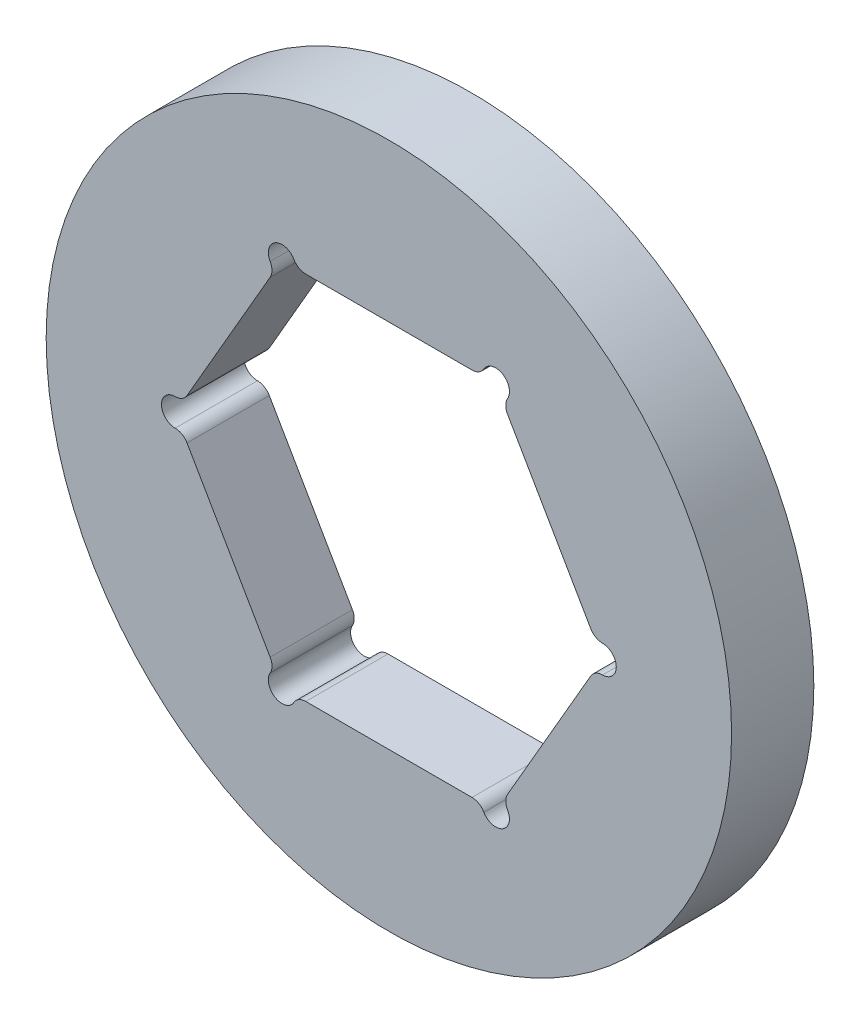
ISO-10303-21;
HEADER;
FILE_DESCRIPTION(('STEP AP214'),'2;1');
FILE_NAME('part.step','',(''),(''),'','','');
FILE_SCHEMA(('AUTOMOTIVE_DESIGN { 1 0 10303 214 1 1 1 1 }'));
ENDSEC;
DATA;
#1=APPLICATION_CONTEXT('core data for automotive mechanical design processes');
#2=APPLICATION_PROTOCOL_DEFINITION('international standard','automotive_design',2000,#1);
#3=PRODUCT_CONTEXT('',#1,'mechanical');
#4=PRODUCT('Part','Part','',(#3));
#5=PRODUCT_RELATED_PRODUCT_CATEGORY('part','',(#4));
#6=PRODUCT_DEFINITION_FORMATION('','',#4);
#7=PRODUCT_DEFINITION_CONTEXT('part definition',#1,'design');
#8=PRODUCT_DEFINITION('design','',#6,#7);
#9=PRODUCT_DEFINITION_SHAPE('','',#8);
#10=(LENGTH_UNIT() NAMED_UNIT(*) SI_UNIT(.MILLI.,.METRE.));
#11=(NAMED_UNIT(*) PLANE_ANGLE_UNIT() SI_UNIT($,.RADIAN.));
#12=(NAMED_UNIT(*) SI_UNIT($,.STERADIAN.) SOLID_ANGLE_UNIT());
#13=UNCERTAINTY_MEASURE_WITH_UNIT(LENGTH_MEASURE(1.E-05),#10,'distance_accuracy_value','');
#14=(GEOMETRIC_REPRESENTATION_CONTEXT(3) GLOBAL_UNCERTAINTY_ASSIGNED_CONTEXT((#13)) GLOBAL_UNIT_ASSIGNED_CONTEXT((#10,
#11,#12)) REPRESENTATION_CONTEXT('',''));
#15=CARTESIAN_POINT('',(0.,0.,0.));
#16=DIRECTION('',(0.,0.,1.));
#17=DIRECTION('',(1.,0.,0.));
#18=AXIS2_PLACEMENT_3D('',#15,#16,#17);
#19=CARTESIAN_POINT('',(0.,0.,3.));
#20=DIRECTION('',(0.,0.,1.));
#21=DIRECTION('',(1.,0.,0.));
#22=AXIS2_PLACEMENT_3D('',#19,#20,#21);
#23=PLANE('',#22);
#24=CARTESIAN_POINT('',(-15.5884572681199,0.,3.));
#25=DIRECTION('',(0.,0.,1.));
#26=DIRECTION('',(1.,0.,0.));
#27=AXIS2_PLACEMENT_3D('',#24,#25,#26);
#28=CIRCLE('',#27,1.);
#29=CARTESIAN_POINT('',(-15.5884572681199,1.00000000000001,3.));
#30=VERTEX_POINT('',#29);
#31=CARTESIAN_POINT('',(-15.5884572681199,-0.999999999999998,3.));
#32=VERTEX_POINT('',#31);
#33=EDGE_CURVE('E215',#30,#32,#28,.T.);
#34=ORIENTED_EDGE('',*,*,#33,.F.);
#35=CARTESIAN_POINT('',(-15.5884572681199,2.,3.));
#36=DIRECTION('',(0.,0.,1.));
#37=DIRECTION('',(1.,0.,0.));
#38=AXIS2_PLACEMENT_3D('',#35,#36,#37);
#39=CIRCLE('',#38,1.);
#40=CARTESIAN_POINT('',(-14.7224318643355,1.5,3.));
#41=VERTEX_POINT('',#40);
#42=EDGE_CURVE('E197',#30,#41,#39,.T.);
#43=ORIENTED_EDGE('',*,*,#42,.T.);
#44=DIRECTION('',(-0.5,-0.866025403784439,0.));
#45=VECTOR('',#44,1.);
#46=CARTESIAN_POINT('',(-7.79422863405995,13.5,3.));
#47=LINE('',#46,#45);
#48=CARTESIAN_POINT('',(-8.66025403784439,12.,3.));
#49=VERTEX_POINT('',#48);
#50=EDGE_CURVE('E255',#49,#41,#47,.T.);
#51=ORIENTED_EDGE('',*,*,#50,.F.);
#52=CARTESIAN_POINT('',(-9.52627944162883,12.5,3.));
#53=DIRECTION('',(0.,0.,1.));
#54=DIRECTION('',(1.,0.,0.));
#55=AXIS2_PLACEMENT_3D('',#52,#53,#54);
#56=CIRCLE('',#55,1.);
#57=CARTESIAN_POINT('',(-8.66025403784439,13.,3.));
#58=VERTEX_POINT('',#57);
#59=EDGE_CURVE('E296',#49,#58,#56,.T.);
#60=ORIENTED_EDGE('',*,*,#59,.T.);
#61=CARTESIAN_POINT('',(-7.79422863405995,13.5,3.));
#62=DIRECTION('',(0.,0.,1.));
#63=DIRECTION('',(1.,0.,0.));
#64=AXIS2_PLACEMENT_3D('',#61,#62,#63);
#65=CIRCLE('',#64,1.);
#66=CARTESIAN_POINT('',(-6.92820323027551,14.,3.));
#67=VERTEX_POINT('',#66);
#68=EDGE_CURVE('E251',#67,#58,#65,.T.);
#69=ORIENTED_EDGE('',*,*,#68,.F.);
#70=CARTESIAN_POINT('',(-6.06217782649107,14.5,3.));
#71=DIRECTION('',(0.,0.,1.));
#72=DIRECTION('',(1.,0.,0.));
#73=AXIS2_PLACEMENT_3D('',#70,#71,#72);
#74=CIRCLE('',#73,1.);
#75=CARTESIAN_POINT('',(-6.06217782649107,13.5,3.));
#76=VERTEX_POINT('',#75);
#77=EDGE_CURVE('E219',#67,#76,#74,.T.);
#78=ORIENTED_EDGE('',*,*,#77,.T.);
#79=DIRECTION('',(-1.,0.,0.));
#80=VECTOR('',#79,1.);
#81=CARTESIAN_POINT('',(7.79422863405996,13.5,3.));
#82=LINE('',#81,#80);
#83=CARTESIAN_POINT('',(6.06217782649108,13.5,3.));
#84=VERTEX_POINT('',#83);
#85=EDGE_CURVE('E270',#84,#76,#82,.T.);
#86=ORIENTED_EDGE('',*,*,#85,.F.);
#87=CARTESIAN_POINT('',(6.06217782649108,14.5,3.));
#88=DIRECTION('',(0.,0.,1.));
#89=DIRECTION('',(1.,0.,0.));
#90=AXIS2_PLACEMENT_3D('',#87,#88,#89);
#91=CIRCLE('',#90,1.);
#92=CARTESIAN_POINT('',(6.92820323027552,14.,3.));
#93=VERTEX_POINT('',#92);
#94=EDGE_CURVE('E300',#84,#93,#91,.T.);
#95=ORIENTED_EDGE('',*,*,#94,.T.);
#96=CARTESIAN_POINT('',(7.79422863405996,13.5,3.));
#97=DIRECTION('',(0.,0.,1.));
#98=DIRECTION('',(1.,0.,0.));
#99=AXIS2_PLACEMENT_3D('',#96,#97,#98);
#100=CIRCLE('',#99,0.999999999999999);
#101=CARTESIAN_POINT('',(8.66025403784439,13.,3.));
#102=VERTEX_POINT('',#101);
#103=EDGE_CURVE('E227',#102,#93,#100,.T.);
#104=ORIENTED_EDGE('',*,*,#103,.F.);
#105=CARTESIAN_POINT('',(9.52627944162883,12.5,3.));
#106=DIRECTION('',(0.,0.,1.));
#107=DIRECTION('',(1.,0.,0.));
#108=AXIS2_PLACEMENT_3D('',#105,#106,#107);
#109=CIRCLE('',#108,1.);
#110=CARTESIAN_POINT('',(8.66025403784439,12.,3.));
#111=VERTEX_POINT('',#110);
#112=EDGE_CURVE('E298',#102,#111,#109,.T.);
#113=ORIENTED_EDGE('',*,*,#112,.T.);
#114=DIRECTION('',(-0.5,0.866025403784439,0.));
#115=VECTOR('',#114,1.);
#116=CARTESIAN_POINT('',(15.5884572681199,0.,3.));
#117=LINE('',#116,#115);
#118=CARTESIAN_POINT('',(14.7224318643355,1.50000000000001,3.));
#119=VERTEX_POINT('',#118);
#120=EDGE_CURVE('E267',#119,#111,#117,.T.);
#121=ORIENTED_EDGE('',*,*,#120,.F.);
#122=CARTESIAN_POINT('',(15.5884572681199,2.00000000000001,3.));
#123=DIRECTION('',(0.,0.,1.));
#124=DIRECTION('',(1.,0.,0.));
#125=AXIS2_PLACEMENT_3D('',#122,#123,#124);
#126=CIRCLE('',#125,1.);
#127=CARTESIAN_POINT('',(15.5884572681199,1.00000000000001,3.));
#128=VERTEX_POINT('',#127);
#129=EDGE_CURVE('E304',#119,#128,#126,.T.);
#130=ORIENTED_EDGE('',*,*,#129,.T.);
#131=CARTESIAN_POINT('',(15.5884572681199,0.,3.));
#132=DIRECTION('',(0.,0.,1.));
#133=DIRECTION('',(1.,0.,0.));
#134=AXIS2_PLACEMENT_3D('',#131,#132,#133);
#135=CIRCLE('',#134,1.);
#136=CARTESIAN_POINT('',(15.5884572681199,-0.999999999999994,3.));
#137=VERTEX_POINT('',#136);
#138=EDGE_CURVE('E244',#137,#128,#135,.T.);
#139=ORIENTED_EDGE('',*,*,#138,.F.);
#140=CARTESIAN_POINT('',(15.5884572681199,-1.99999999999999,3.));
#141=DIRECTION('',(0.,0.,1.));
#142=DIRECTION('',(1.,0.,0.));
#143=AXIS2_PLACEMENT_3D('',#140,#141,#142);
#144=CIRCLE('',#143,1.);
#145=CARTESIAN_POINT('',(14.7224318643355,-1.49999999999999,3.));
#146=VERTEX_POINT('',#145);
#147=EDGE_CURVE('E302',#137,#146,#144,.T.);
#148=ORIENTED_EDGE('',*,*,#147,.T.);
#149=DIRECTION('',(0.5,0.866025403784439,0.));
#150=VECTOR('',#149,1.);
#151=CARTESIAN_POINT('',(7.79422863405995,-13.5,3.));
#152=LINE('',#151,#150);
#153=CARTESIAN_POINT('',(8.66025403784439,-12.,3.));
#154=VERTEX_POINT('',#153);
#155=EDGE_CURVE('E264',#154,#146,#152,.T.);
#156=ORIENTED_EDGE('',*,*,#155,.F.);
#157=CARTESIAN_POINT('',(9.52627944162883,-12.5,3.));
#158=DIRECTION('',(0.,0.,1.));
#159=DIRECTION('',(1.,0.,0.));
#160=AXIS2_PLACEMENT_3D('',#157,#158,#159);
#161=CIRCLE('',#160,1.);
#162=CARTESIAN_POINT('',(8.66025403784439,-13.,3.));
#163=VERTEX_POINT('',#162);
#164=EDGE_CURVE('E306',#154,#163,#161,.T.);
#165=ORIENTED_EDGE('',*,*,#164,.T.);
#166=CARTESIAN_POINT('',(7.79422863405995,-13.5,3.));
#167=DIRECTION('',(0.,0.,1.));
#168=DIRECTION('',(1.,0.,0.));
#169=AXIS2_PLACEMENT_3D('',#166,#167,#168);
#170=CIRCLE('',#169,1.);
#171=CARTESIAN_POINT('',(6.92820323027551,-14.,3.));
#172=VERTEX_POINT('',#171);
#173=EDGE_CURVE('E238',#172,#163,#170,.T.);
#174=ORIENTED_EDGE('',*,*,#173,.F.);
#175=CARTESIAN_POINT('',(6.06217782649107,-14.5,3.));
#176=DIRECTION('',(0.,0.,1.));
#177=DIRECTION('',(1.,0.,0.));
#178=AXIS2_PLACEMENT_3D('',#175,#176,#177);
#179=CIRCLE('',#178,1.);
#180=CARTESIAN_POINT('',(6.06217782649107,-13.5,3.));
#181=VERTEX_POINT('',#180);
#182=EDGE_CURVE('E308',#172,#181,#179,.T.);
#183=ORIENTED_EDGE('',*,*,#182,.T.);
#184=DIRECTION('',(1.,0.,0.));
#185=VECTOR('',#184,1.);
#186=CARTESIAN_POINT('',(-7.79422863405996,-13.5,3.));
#187=LINE('',#186,#185);
#188=CARTESIAN_POINT('',(-6.06217782649108,-13.5,3.));
#189=VERTEX_POINT('',#188);
#190=EDGE_CURVE('E261',#189,#181,#187,.T.);
#191=ORIENTED_EDGE('',*,*,#190,.F.);
#192=CARTESIAN_POINT('',(-6.06217782649108,-14.5,3.));
#193=DIRECTION('',(0.,0.,1.));
#194=DIRECTION('',(1.,0.,0.));
#195=AXIS2_PLACEMENT_3D('',#192,#193,#194);
#196=CIRCLE('',#195,1.);
#197=CARTESIAN_POINT('',(-6.92820323027552,-14.,3.));
#198=VERTEX_POINT('',#197);
#199=EDGE_CURVE('E310',#189,#198,#196,.T.);
#200=ORIENTED_EDGE('',*,*,#199,.T.);
#201=CARTESIAN_POINT('',(-7.79422863405996,-13.5,3.));
#202=DIRECTION('',(0.,0.,1.));
#203=DIRECTION('',(1.,0.,0.));
#204=AXIS2_PLACEMENT_3D('',#201,#202,#203);
#205=CIRCLE('',#204,1.);
#206=CARTESIAN_POINT('',(-8.66025403784439,-13.,3.));
#207=VERTEX_POINT('',#206);
#208=EDGE_CURVE('E230',#207,#198,#205,.T.);
#209=ORIENTED_EDGE('',*,*,#208,.F.);
#210=CARTESIAN_POINT('',(-9.52627944162883,-12.5,3.));
#211=DIRECTION('',(0.,0.,1.));
#212=DIRECTION('',(1.,0.,0.));
#213=AXIS2_PLACEMENT_3D('',#210,#211,#212);
#214=CIRCLE('',#213,1.);
#215=CARTESIAN_POINT('',(-8.66025403784439,-12.,3.));
#216=VERTEX_POINT('',#215);
#217=EDGE_CURVE('E312',#207,#216,#214,.T.);
#218=ORIENTED_EDGE('',*,*,#217,.T.);
#219=DIRECTION('',(0.5,-0.866025403784439,0.));
#220=VECTOR('',#219,1.);
#221=CARTESIAN_POINT('',(-15.5884572681199,0.,3.));
#222=LINE('',#221,#220);
#223=CARTESIAN_POINT('',(-14.7224318643355,-1.5,3.));
#224=VERTEX_POINT('',#223);
#225=EDGE_CURVE('E257',#224,#216,#222,.T.);
#226=ORIENTED_EDGE('',*,*,#225,.F.);
#227=CARTESIAN_POINT('',(-15.5884572681199,-2.,3.));
#228=DIRECTION('',(0.,0.,1.));
#229=DIRECTION('',(1.,0.,0.));
#230=AXIS2_PLACEMENT_3D('',#227,#228,#229);
#231=CIRCLE('',#230,1.);
#232=EDGE_CURVE('E208',#224,#32,#231,.T.);
#233=ORIENTED_EDGE('',*,*,#232,.T.);
#234=EDGE_LOOP('',(#34,#43,#51,#60,#69,#78,#86,#95,#104,#113,#121,#130,#139,#148,#156,#165,#174,
#183,#191,#200,#209,#218,#226,#233));
#235=FACE_BOUND('',#234,.T.);
#236=CARTESIAN_POINT('',(0.,0.,3.));
#237=DIRECTION('',(0.,0.,1.));
#238=DIRECTION('',(1.,0.,0.));
#239=AXIS2_PLACEMENT_3D('',#236,#237,#238);
#240=CIRCLE('',#239,25.);
#241=CARTESIAN_POINT('',(25.,0.,3.));
#242=VERTEX_POINT('',#241);
#243=EDGE_CURVE('E289',#242,#242,#240,.T.);
#244=ORIENTED_EDGE('',*,*,#243,.T.);
#245=EDGE_LOOP('',(#244));
#246=FACE_BOUND('',#245,.T.);
#247=ADVANCED_FACE('F33',(#235,#246),#23,.T.);
#248=CARTESIAN_POINT('',(0.,0.,-3.));
#249=DIRECTION('',(0.,0.,1.));
#250=DIRECTION('',(1.,0.,0.));
#251=AXIS2_PLACEMENT_3D('',#248,#249,#250);
#252=PLANE('',#251);
#253=CARTESIAN_POINT('',(0.,0.,-3.));
#254=DIRECTION('',(0.,0.,1.));
#255=DIRECTION('',(1.,0.,0.));
#256=AXIS2_PLACEMENT_3D('',#253,#254,#255);
#257=CIRCLE('',#256,25.);
#258=CARTESIAN_POINT('',(25.,0.,-3.));
#259=VERTEX_POINT('',#258);
#260=EDGE_CURVE('E273',#259,#259,#257,.T.);
#261=ORIENTED_EDGE('',*,*,#260,.F.);
#262=EDGE_LOOP('',(#261));
#263=FACE_BOUND('',#262,.T.);
#264=DIRECTION('',(-0.5,-0.866025403784439,0.));
#265=VECTOR('',#264,1.);
#266=CARTESIAN_POINT('',(-7.79422863405995,13.5,-3.));
#267=LINE('',#266,#265);
#268=CARTESIAN_POINT('',(-8.66025403784439,12.,-3.));
#269=VERTEX_POINT('',#268);
#270=CARTESIAN_POINT('',(-14.7224318643355,1.5,-3.));
#271=VERTEX_POINT('',#270);
#272=EDGE_CURVE('E250',#269,#271,#267,.T.);
#273=ORIENTED_EDGE('',*,*,#272,.T.);
#274=CARTESIAN_POINT('',(-15.5884572681199,2.,-3.));
#275=DIRECTION('',(0.,0.,1.));
#276=DIRECTION('',(1.,0.,0.));
#277=AXIS2_PLACEMENT_3D('',#274,#275,#276);
#278=CIRCLE('',#277,1.);
#279=CARTESIAN_POINT('',(-15.5884572681199,1.00000000000001,-3.));
#280=VERTEX_POINT('',#279);
#281=EDGE_CURVE('E337',#271,#280,#278,.F.);
#282=ORIENTED_EDGE('',*,*,#281,.T.);
#283=CARTESIAN_POINT('',(-15.5884572681199,0.,-3.));
#284=DIRECTION('',(0.,0.,1.));
#285=DIRECTION('',(1.,0.,0.));
#286=AXIS2_PLACEMENT_3D('',#283,#284,#285);
#287=CIRCLE('',#286,1.);
#288=CARTESIAN_POINT('',(-15.5884572681199,-0.999999999999998,-3.));
#289=VERTEX_POINT('',#288);
#290=EDGE_CURVE('E218',#280,#289,#287,.T.);
#291=ORIENTED_EDGE('',*,*,#290,.T.);
#292=CARTESIAN_POINT('',(-15.5884572681199,-2.,-3.));
#293=DIRECTION('',(0.,0.,1.));
#294=DIRECTION('',(1.,0.,0.));
#295=AXIS2_PLACEMENT_3D('',#292,#293,#294);
#296=CIRCLE('',#295,1.);
#297=CARTESIAN_POINT('',(-14.7224318643355,-1.5,-3.));
#298=VERTEX_POINT('',#297);
#299=EDGE_CURVE('E335',#289,#298,#296,.F.);
#300=ORIENTED_EDGE('',*,*,#299,.T.);
#301=DIRECTION('',(0.5,-0.866025403784439,0.));
#302=VECTOR('',#301,1.);
#303=CARTESIAN_POINT('',(-15.5884572681199,0.,-3.));
#304=LINE('',#303,#302);
#305=CARTESIAN_POINT('',(-8.66025403784439,-12.,-3.));
#306=VERTEX_POINT('',#305);
#307=EDGE_CURVE('E276',#298,#306,#304,.T.);
#308=ORIENTED_EDGE('',*,*,#307,.T.);
#309=CARTESIAN_POINT('',(-9.52627944162883,-12.5,-3.));
#310=DIRECTION('',(0.,0.,1.));
#311=DIRECTION('',(1.,0.,0.));
#312=AXIS2_PLACEMENT_3D('',#309,#310,#311);
#313=CIRCLE('',#312,1.);
#314=CARTESIAN_POINT('',(-8.66025403784439,-13.,-3.));
#315=VERTEX_POINT('',#314);
#316=EDGE_CURVE('E333',#306,#315,#313,.F.);
#317=ORIENTED_EDGE('',*,*,#316,.T.);
#318=CARTESIAN_POINT('',(-7.79422863405996,-13.5,-3.));
#319=DIRECTION('',(0.,0.,1.));
#320=DIRECTION('',(1.,0.,0.));
#321=AXIS2_PLACEMENT_3D('',#318,#319,#320);
#322=CIRCLE('',#321,1.);
#323=CARTESIAN_POINT('',(-6.92820323027552,-14.,-3.));
#324=VERTEX_POINT('',#323);
#325=EDGE_CURVE('E225',#315,#324,#322,.T.);
#326=ORIENTED_EDGE('',*,*,#325,.T.);
#327=CARTESIAN_POINT('',(-6.06217782649108,-14.5,-3.));
#328=DIRECTION('',(0.,0.,1.));
#329=DIRECTION('',(1.,0.,0.));
#330=AXIS2_PLACEMENT_3D('',#327,#328,#329);
#331=CIRCLE('',#330,1.);
#332=CARTESIAN_POINT('',(-6.06217782649108,-13.5,-3.));
#333=VERTEX_POINT('',#332);
#334=EDGE_CURVE('E331',#324,#333,#331,.F.);
#335=ORIENTED_EDGE('',*,*,#334,.T.);
#336=DIRECTION('',(1.,0.,0.));
#337=VECTOR('',#336,1.);
#338=CARTESIAN_POINT('',(-7.79422863405996,-13.5,-3.));
#339=LINE('',#338,#337);
#340=CARTESIAN_POINT('',(6.06217782649107,-13.5,-3.));
#341=VERTEX_POINT('',#340);
#342=EDGE_CURVE('E279',#333,#341,#339,.T.);
#343=ORIENTED_EDGE('',*,*,#342,.T.);
#344=CARTESIAN_POINT('',(6.06217782649107,-14.5,-3.));
#345=DIRECTION('',(0.,0.,1.));
#346=DIRECTION('',(1.,0.,0.));
#347=AXIS2_PLACEMENT_3D('',#344,#345,#346);
#348=CIRCLE('',#347,1.);
#349=CARTESIAN_POINT('',(6.92820323027551,-14.,-3.));
#350=VERTEX_POINT('',#349);
#351=EDGE_CURVE('E56',#341,#350,#348,.F.);
#352=ORIENTED_EDGE('',*,*,#351,.T.);
#353=CARTESIAN_POINT('',(7.79422863405995,-13.5,-3.));
#354=DIRECTION('',(0.,0.,1.));
#355=DIRECTION('',(1.,0.,0.));
#356=AXIS2_PLACEMENT_3D('',#353,#354,#355);
#357=CIRCLE('',#356,1.);
#358=CARTESIAN_POINT('',(8.66025403784439,-13.,-3.));
#359=VERTEX_POINT('',#358);
#360=EDGE_CURVE('E236',#350,#359,#357,.T.);
#361=ORIENTED_EDGE('',*,*,#360,.T.);
#362=CARTESIAN_POINT('',(9.52627944162883,-12.5,-3.));
#363=DIRECTION('',(0.,0.,1.));
#364=DIRECTION('',(1.,0.,0.));
#365=AXIS2_PLACEMENT_3D('',#362,#363,#364);
#366=CIRCLE('',#365,1.);
#367=CARTESIAN_POINT('',(8.66025403784439,-12.,-3.));
#368=VERTEX_POINT('',#367);
#369=EDGE_CURVE('E48',#359,#368,#366,.F.);
#370=ORIENTED_EDGE('',*,*,#369,.T.);
#371=DIRECTION('',(0.5,0.866025403784439,0.));
#372=VECTOR('',#371,1.);
#373=CARTESIAN_POINT('',(7.79422863405995,-13.5,-3.));
#374=LINE('',#373,#372);
#375=CARTESIAN_POINT('',(14.7224318643355,-1.49999999999999,-3.));
#376=VERTEX_POINT('',#375);
#377=EDGE_CURVE('E281',#368,#376,#374,.T.);
#378=ORIENTED_EDGE('',*,*,#377,.T.);
#379=CARTESIAN_POINT('',(15.5884572681199,-1.99999999999999,-3.));
#380=DIRECTION('',(0.,0.,1.));
#381=DIRECTION('',(1.,0.,0.));
#382=AXIS2_PLACEMENT_3D('',#379,#380,#381);
#383=CIRCLE('',#382,1.);
#384=CARTESIAN_POINT('',(15.5884572681199,-0.999999999999994,-3.));
#385=VERTEX_POINT('',#384);
#386=EDGE_CURVE('E325',#376,#385,#383,.F.);
#387=ORIENTED_EDGE('',*,*,#386,.T.);
#388=CARTESIAN_POINT('',(15.5884572681199,0.,-3.));
#389=DIRECTION('',(0.,0.,1.));
#390=DIRECTION('',(1.,0.,0.));
#391=AXIS2_PLACEMENT_3D('',#388,#389,#390);
#392=CIRCLE('',#391,1.);
#393=CARTESIAN_POINT('',(15.5884572681199,1.00000000000001,-3.));
#394=VERTEX_POINT('',#393);
#395=EDGE_CURVE('E241',#385,#394,#392,.T.);
#396=ORIENTED_EDGE('',*,*,#395,.T.);
#397=CARTESIAN_POINT('',(15.5884572681199,2.00000000000001,-3.));
#398=DIRECTION('',(0.,0.,1.));
#399=DIRECTION('',(1.,0.,0.));
#400=AXIS2_PLACEMENT_3D('',#397,#398,#399);
#401=CIRCLE('',#400,1.);
#402=CARTESIAN_POINT('',(14.7224318643355,1.50000000000001,-3.));
#403=VERTEX_POINT('',#402);
#404=EDGE_CURVE('E327',#394,#403,#401,.F.);
#405=ORIENTED_EDGE('',*,*,#404,.T.);
#406=DIRECTION('',(-0.5,0.866025403784439,0.));
#407=VECTOR('',#406,1.);
#408=CARTESIAN_POINT('',(15.5884572681199,0.,-3.));
#409=LINE('',#408,#407);
#410=CARTESIAN_POINT('',(8.66025403784439,12.,-3.));
#411=VERTEX_POINT('',#410);
#412=EDGE_CURVE('E284',#403,#411,#409,.T.);
#413=ORIENTED_EDGE('',*,*,#412,.T.);
#414=CARTESIAN_POINT('',(9.52627944162883,12.5,-3.));
#415=DIRECTION('',(0.,0.,1.));
#416=DIRECTION('',(1.,0.,0.));
#417=AXIS2_PLACEMENT_3D('',#414,#415,#416);
#418=CIRCLE('',#417,1.);
#419=CARTESIAN_POINT('',(8.66025403784439,13.,-3.));
#420=VERTEX_POINT('',#419);
#421=EDGE_CURVE('E321',#411,#420,#418,.F.);
#422=ORIENTED_EDGE('',*,*,#421,.T.);
#423=CARTESIAN_POINT('',(7.79422863405996,13.5,-3.));
#424=DIRECTION('',(0.,0.,1.));
#425=DIRECTION('',(1.,0.,0.));
#426=AXIS2_PLACEMENT_3D('',#423,#424,#425);
#427=CIRCLE('',#426,0.999999999999999);
#428=CARTESIAN_POINT('',(6.92820323027552,14.,-3.));
#429=VERTEX_POINT('',#428);
#430=EDGE_CURVE('E254',#420,#429,#427,.T.);
#431=ORIENTED_EDGE('',*,*,#430,.T.);
#432=CARTESIAN_POINT('',(6.06217782649108,14.5,-3.));
#433=DIRECTION('',(0.,0.,1.));
#434=DIRECTION('',(1.,0.,0.));
#435=AXIS2_PLACEMENT_3D('',#432,#433,#434);
#436=CIRCLE('',#435,1.);
#437=CARTESIAN_POINT('',(6.06217782649108,13.5,-3.));
#438=VERTEX_POINT('',#437);
#439=EDGE_CURVE('E323',#429,#438,#436,.F.);
#440=ORIENTED_EDGE('',*,*,#439,.T.);
#441=DIRECTION('',(-1.,0.,0.));
#442=VECTOR('',#441,1.);
#443=CARTESIAN_POINT('',(7.79422863405996,13.5,-3.));
#444=LINE('',#443,#442);
#445=CARTESIAN_POINT('',(-6.06217782649107,13.5,-3.));
#446=VERTEX_POINT('',#445);
#447=EDGE_CURVE('E258',#438,#446,#444,.T.);
#448=ORIENTED_EDGE('',*,*,#447,.T.);
#449=CARTESIAN_POINT('',(-6.06217782649107,14.5,-3.));
#450=DIRECTION('',(0.,0.,1.));
#451=DIRECTION('',(1.,0.,0.));
#452=AXIS2_PLACEMENT_3D('',#449,#450,#451);
#453=CIRCLE('',#452,1.);
#454=CARTESIAN_POINT('',(-6.92820323027551,14.,-3.));
#455=VERTEX_POINT('',#454);
#456=EDGE_CURVE('E317',#446,#455,#453,.F.);
#457=ORIENTED_EDGE('',*,*,#456,.T.);
#458=CARTESIAN_POINT('',(-7.79422863405995,13.5,-3.));
#459=DIRECTION('',(0.,0.,1.));
#460=DIRECTION('',(1.,0.,0.));
#461=AXIS2_PLACEMENT_3D('',#458,#459,#460);
#462=CIRCLE('',#461,1.);
#463=CARTESIAN_POINT('',(-8.66025403784439,13.,-3.));
#464=VERTEX_POINT('',#463);
#465=EDGE_CURVE('E247',#455,#464,#462,.T.);
#466=ORIENTED_EDGE('',*,*,#465,.T.);
#467=CARTESIAN_POINT('',(-9.52627944162883,12.5,-3.));
#468=DIRECTION('',(0.,0.,1.));
#469=DIRECTION('',(1.,0.,0.));
#470=AXIS2_PLACEMENT_3D('',#467,#468,#469);
#471=CIRCLE('',#470,1.);
#472=EDGE_CURVE('E319',#464,#269,#471,.F.);
#473=ORIENTED_EDGE('',*,*,#472,.T.);
#474=EDGE_LOOP('',(#273,#282,#291,#300,#308,#317,#326,#335,#343,#352,#361,#370,#378,#387,#396,
#405,#413,#422,#431,#440,#448,#457,#466,#473));
#475=FACE_BOUND('',#474,.T.);
#476=ADVANCED_FACE('F395',(#263,#475),#252,.F.);
#477=CARTESIAN_POINT('',(0.,0.,3.));
#478=DIRECTION('',(0.,0.,-1.));
#479=DIRECTION('',(-1.,0.,0.));
#480=AXIS2_PLACEMENT_3D('',#477,#478,#479);
#481=CYLINDRICAL_SURFACE('',#480,25.);
#482=ORIENTED_EDGE('',*,*,#243,.F.);
#483=EDGE_LOOP('',(#482));
#484=FACE_BOUND('',#483,.T.);
#485=ORIENTED_EDGE('',*,*,#260,.T.);
#486=EDGE_LOOP('',(#485));
#487=FACE_BOUND('',#486,.T.);
#488=ADVANCED_FACE('F476',(#484,#487),#481,.T.);
#489=CARTESIAN_POINT('',(-7.79422863405995,13.5,3.));
#490=DIRECTION('',(0.866025403784439,-0.5,0.));
#491=DIRECTION('',(0.5,0.866025403784439,0.));
#492=AXIS2_PLACEMENT_3D('',#489,#490,#491);
#493=PLANE('',#492);
#494=ORIENTED_EDGE('',*,*,#50,.T.);
#495=DIRECTION('',(0.,0.,-1.));
#496=VECTOR('',#495,1.);
#497=CARTESIAN_POINT('',(-14.7224318643355,1.5,-3.));
#498=LINE('',#497,#496);
#499=EDGE_CURVE('E202',#41,#271,#498,.T.);
#500=ORIENTED_EDGE('',*,*,#499,.T.);
#501=ORIENTED_EDGE('',*,*,#272,.F.);
#502=DIRECTION('',(0.,0.,-1.));
#503=VECTOR('',#502,1.);
#504=CARTESIAN_POINT('',(-8.66025403784439,12.,3.));
#505=LINE('',#504,#503);
#506=EDGE_CURVE('E207',#269,#49,#505,.F.);
#507=ORIENTED_EDGE('',*,*,#506,.T.);
#508=EDGE_LOOP('',(#494,#500,#501,#507));
#509=FACE_BOUND('',#508,.T.);
#510=ADVANCED_FACE('F474',(#509),#493,.T.);
#511=CARTESIAN_POINT('',(-15.5884572681199,0.,3.));
#512=DIRECTION('',(0.866025403784439,0.5,0.));
#513=DIRECTION('',(-0.5,0.866025403784439,0.));
#514=AXIS2_PLACEMENT_3D('',#511,#512,#513);
#515=PLANE('',#514);
#516=ORIENTED_EDGE('',*,*,#307,.F.);
#517=DIRECTION('',(0.,0.,-1.));
#518=VECTOR('',#517,1.);
#519=CARTESIAN_POINT('',(-14.7224318643355,-1.5,3.));
#520=LINE('',#519,#518);
#521=EDGE_CURVE('E341',#298,#224,#520,.F.);
#522=ORIENTED_EDGE('',*,*,#521,.T.);
#523=ORIENTED_EDGE('',*,*,#225,.T.);
#524=DIRECTION('',(0.,0.,-1.));
#525=VECTOR('',#524,1.);
#526=CARTESIAN_POINT('',(-8.66025403784439,-12.,-3.));
#527=LINE('',#526,#525);
#528=EDGE_CURVE('E339',#216,#306,#527,.T.);
#529=ORIENTED_EDGE('',*,*,#528,.T.);
#530=EDGE_LOOP('',(#516,#522,#523,#529));
#531=FACE_BOUND('',#530,.T.);
#532=ADVANCED_FACE('F469',(#531),#515,.T.);
#533=CARTESIAN_POINT('',(-7.79422863405996,-13.5,3.));
#534=DIRECTION('',(0.,1.,0.));
#535=DIRECTION('',(-1.,0.,0.));
#536=AXIS2_PLACEMENT_3D('',#533,#534,#535);
#537=PLANE('',#536);
#538=ORIENTED_EDGE('',*,*,#342,.F.);
#539=DIRECTION('',(0.,0.,-1.));
#540=VECTOR('',#539,1.);
#541=CARTESIAN_POINT('',(-6.06217782649108,-13.5,3.));
#542=LINE('',#541,#540);
#543=EDGE_CURVE('E351',#333,#189,#542,.F.);
#544=ORIENTED_EDGE('',*,*,#543,.T.);
#545=ORIENTED_EDGE('',*,*,#190,.T.);
#546=DIRECTION('',(0.,0.,-1.));
#547=VECTOR('',#546,1.);
#548=CARTESIAN_POINT('',(6.06217782649107,-13.5,-3.));
#549=LINE('',#548,#547);
#550=EDGE_CURVE('E349',#181,#341,#549,.T.);
#551=ORIENTED_EDGE('',*,*,#550,.T.);
#552=EDGE_LOOP('',(#538,#544,#545,#551));
#553=FACE_BOUND('',#552,.T.);
#554=ADVANCED_FACE('F453',(#553),#537,.T.);
#555=CARTESIAN_POINT('',(7.79422863405995,-13.5,3.));
#556=DIRECTION('',(-0.866025403784439,0.5,0.));
#557=DIRECTION('',(-0.5,-0.866025403784439,0.));
#558=AXIS2_PLACEMENT_3D('',#555,#556,#557);
#559=PLANE('',#558);
#560=ORIENTED_EDGE('',*,*,#377,.F.);
#561=DIRECTION('',(0.,0.,-1.));
#562=VECTOR('',#561,1.);
#563=CARTESIAN_POINT('',(8.66025403784439,-12.,3.));
#564=LINE('',#563,#562);
#565=EDGE_CURVE('E360',#368,#154,#564,.F.);
#566=ORIENTED_EDGE('',*,*,#565,.T.);
#567=ORIENTED_EDGE('',*,*,#155,.T.);
#568=DIRECTION('',(0.,0.,-1.));
#569=VECTOR('',#568,1.);
#570=CARTESIAN_POINT('',(14.7224318643355,-1.49999999999999,-3.));
#571=LINE('',#570,#569);
#572=EDGE_CURVE('E358',#146,#376,#571,.T.);
#573=ORIENTED_EDGE('',*,*,#572,.T.);
#574=EDGE_LOOP('',(#560,#566,#567,#573));
#575=FACE_BOUND('',#574,.T.);
#576=ADVANCED_FACE('F440',(#575),#559,.T.);
#577=CARTESIAN_POINT('',(15.5884572681199,0.,3.));
#578=DIRECTION('',(-0.866025403784439,-0.5,0.));
#579=DIRECTION('',(0.5,-0.866025403784439,0.));
#580=AXIS2_PLACEMENT_3D('',#577,#578,#579);
#581=PLANE('',#580);
#582=ORIENTED_EDGE('',*,*,#412,.F.);
#583=DIRECTION('',(0.,0.,-1.));
#584=VECTOR('',#583,1.);
#585=CARTESIAN_POINT('',(14.7224318643355,1.50000000000001,3.));
#586=LINE('',#585,#584);
#587=EDGE_CURVE('E370',#403,#119,#586,.F.);
#588=ORIENTED_EDGE('',*,*,#587,.T.);
#589=ORIENTED_EDGE('',*,*,#120,.T.);
#590=DIRECTION('',(0.,0.,-1.));
#591=VECTOR('',#590,1.);
#592=CARTESIAN_POINT('',(8.66025403784439,12.,-3.));
#593=LINE('',#592,#591);
#594=EDGE_CURVE('E368',#111,#411,#593,.T.);
#595=ORIENTED_EDGE('',*,*,#594,.T.);
#596=EDGE_LOOP('',(#582,#588,#589,#595));
#597=FACE_BOUND('',#596,.T.);
#598=ADVANCED_FACE('F422',(#597),#581,.T.);
#599=CARTESIAN_POINT('',(7.79422863405996,13.5,3.));
#600=DIRECTION('',(0.,-1.,0.));
#601=DIRECTION('',(1.,0.,0.));
#602=AXIS2_PLACEMENT_3D('',#599,#600,#601);
#603=PLANE('',#602);
#604=ORIENTED_EDGE('',*,*,#447,.F.);
#605=DIRECTION('',(0.,0.,-1.));
#606=VECTOR('',#605,1.);
#607=CARTESIAN_POINT('',(6.06217782649108,13.5,3.));
#608=LINE('',#607,#606);
#609=EDGE_CURVE('E380',#438,#84,#608,.F.);
#610=ORIENTED_EDGE('',*,*,#609,.T.);
#611=ORIENTED_EDGE('',*,*,#85,.T.);
#612=DIRECTION('',(0.,0.,-1.));
#613=VECTOR('',#612,1.);
#614=CARTESIAN_POINT('',(-6.06217782649107,13.5,-3.));
#615=LINE('',#614,#613);
#616=EDGE_CURVE('E378',#76,#446,#615,.T.);
#617=ORIENTED_EDGE('',*,*,#616,.T.);
#618=EDGE_LOOP('',(#604,#610,#611,#617));
#619=FACE_BOUND('',#618,.T.);
#620=ADVANCED_FACE('F400',(#619),#603,.T.);
#621=CARTESIAN_POINT('',(-7.79422863405995,13.5,-3.));
#622=DIRECTION('',(0.,0.,1.));
#623=DIRECTION('',(1.,0.,0.));
#624=AXIS2_PLACEMENT_3D('',#621,#622,#623);
#625=CYLINDRICAL_SURFACE('',#624,1.);
#626=ORIENTED_EDGE('',*,*,#68,.T.);
#627=DIRECTION('',(0.,0.,1.));
#628=VECTOR('',#627,1.);
#629=CARTESIAN_POINT('',(-8.66025403784439,13.,-3.));
#630=LINE('',#629,#628);
#631=EDGE_CURVE('E11',#58,#464,#630,.F.);
#632=ORIENTED_EDGE('',*,*,#631,.T.);
#633=ORIENTED_EDGE('',*,*,#465,.F.);
#634=DIRECTION('',(0.,0.,1.));
#635=VECTOR('',#634,1.);
#636=CARTESIAN_POINT('',(-6.92820323027551,14.,-3.));
#637=LINE('',#636,#635);
#638=EDGE_CURVE('E41',#455,#67,#637,.T.);
#639=ORIENTED_EDGE('',*,*,#638,.T.);
#640=EDGE_LOOP('',(#626,#632,#633,#639));
#641=FACE_BOUND('',#640,.T.);
#642=ADVANCED_FACE('F386',(#641),#625,.F.);
#643=CARTESIAN_POINT('',(7.79422863405996,13.5,-3.));
#644=DIRECTION('',(0.,0.,1.));
#645=DIRECTION('',(1.,0.,0.));
#646=AXIS2_PLACEMENT_3D('',#643,#644,#645);
#647=CYLINDRICAL_SURFACE('',#646,0.999999999999999);
#648=ORIENTED_EDGE('',*,*,#103,.T.);
#649=DIRECTION('',(0.,0.,1.));
#650=VECTOR('',#649,1.);
#651=CARTESIAN_POINT('',(6.92820323027552,14.,-3.));
#652=LINE('',#651,#650);
#653=EDGE_CURVE('E375',#93,#429,#652,.F.);
#654=ORIENTED_EDGE('',*,*,#653,.T.);
#655=ORIENTED_EDGE('',*,*,#430,.F.);
#656=DIRECTION('',(0.,0.,1.));
#657=VECTOR('',#656,1.);
#658=CARTESIAN_POINT('',(8.66025403784439,13.,-3.));
#659=LINE('',#658,#657);
#660=EDGE_CURVE('E372',#420,#102,#659,.T.);
#661=ORIENTED_EDGE('',*,*,#660,.T.);
#662=EDGE_LOOP('',(#648,#654,#655,#661));
#663=FACE_BOUND('',#662,.T.);
#664=ADVANCED_FACE('F411',(#663),#647,.F.);
#665=CARTESIAN_POINT('',(15.5884572681199,0.,-3.));
#666=DIRECTION('',(0.,0.,1.));
#667=DIRECTION('',(1.,0.,0.));
#668=AXIS2_PLACEMENT_3D('',#665,#666,#667);
#669=CYLINDRICAL_SURFACE('',#668,1.);
#670=ORIENTED_EDGE('',*,*,#138,.T.);
#671=DIRECTION('',(0.,0.,1.));
#672=VECTOR('',#671,1.);
#673=CARTESIAN_POINT('',(15.5884572681199,1.00000000000001,-3.));
#674=LINE('',#673,#672);
#675=EDGE_CURVE('E365',#128,#394,#674,.F.);
#676=ORIENTED_EDGE('',*,*,#675,.T.);
#677=ORIENTED_EDGE('',*,*,#395,.F.);
#678=DIRECTION('',(0.,0.,1.));
#679=VECTOR('',#678,1.);
#680=CARTESIAN_POINT('',(15.5884572681199,-0.999999999999994,-3.));
#681=LINE('',#680,#679);
#682=EDGE_CURVE('E362',#385,#137,#681,.T.);
#683=ORIENTED_EDGE('',*,*,#682,.T.);
#684=EDGE_LOOP('',(#670,#676,#677,#683));
#685=FACE_BOUND('',#684,.T.);
#686=ADVANCED_FACE('F429',(#685),#669,.F.);
#687=CARTESIAN_POINT('',(7.79422863405995,-13.5,-3.));
#688=DIRECTION('',(0.,0.,1.));
#689=DIRECTION('',(1.,0.,0.));
#690=AXIS2_PLACEMENT_3D('',#687,#688,#689);
#691=CYLINDRICAL_SURFACE('',#690,1.);
#692=ORIENTED_EDGE('',*,*,#360,.F.);
#693=DIRECTION('',(0.,0.,1.));
#694=VECTOR('',#693,1.);
#695=CARTESIAN_POINT('',(6.92820323027551,-14.,-3.));
#696=LINE('',#695,#694);
#697=EDGE_CURVE('E355',#350,#172,#696,.T.);
#698=ORIENTED_EDGE('',*,*,#697,.T.);
#699=ORIENTED_EDGE('',*,*,#173,.T.);
#700=DIRECTION('',(0.,0.,1.));
#701=VECTOR('',#700,1.);
#702=CARTESIAN_POINT('',(8.66025403784439,-13.,-3.));
#703=LINE('',#702,#701);
#704=EDGE_CURVE('E353',#163,#359,#703,.F.);
#705=ORIENTED_EDGE('',*,*,#704,.T.);
#706=EDGE_LOOP('',(#692,#698,#699,#705));
#707=FACE_BOUND('',#706,.T.);
#708=ADVANCED_FACE('F444',(#707),#691,.F.);
#709=CARTESIAN_POINT('',(-7.79422863405996,-13.5,-3.));
#710=DIRECTION('',(0.,0.,1.));
#711=DIRECTION('',(1.,0.,0.));
#712=AXIS2_PLACEMENT_3D('',#709,#710,#711);
#713=CYLINDRICAL_SURFACE('',#712,1.);
#714=ORIENTED_EDGE('',*,*,#325,.F.);
#715=DIRECTION('',(0.,0.,1.));
#716=VECTOR('',#715,1.);
#717=CARTESIAN_POINT('',(-8.66025403784439,-13.,-3.));
#718=LINE('',#717,#716);
#719=EDGE_CURVE('E346',#315,#207,#718,.T.);
#720=ORIENTED_EDGE('',*,*,#719,.T.);
#721=ORIENTED_EDGE('',*,*,#208,.T.);
#722=DIRECTION('',(0.,0.,1.));
#723=VECTOR('',#722,1.);
#724=CARTESIAN_POINT('',(-6.92820323027552,-14.,-3.));
#725=LINE('',#724,#723);
#726=EDGE_CURVE('E343',#198,#324,#725,.F.);
#727=ORIENTED_EDGE('',*,*,#726,.T.);
#728=EDGE_LOOP('',(#714,#720,#721,#727));
#729=FACE_BOUND('',#728,.T.);
#730=ADVANCED_FACE('F461',(#729),#713,.F.);
#731=CARTESIAN_POINT('',(-15.5884572681199,0.,-3.));
#732=DIRECTION('',(0.,0.,1.));
#733=DIRECTION('',(1.,0.,0.));
#734=AXIS2_PLACEMENT_3D('',#731,#732,#733);
#735=CYLINDRICAL_SURFACE('',#734,1.);
#736=ORIENTED_EDGE('',*,*,#290,.F.);
#737=DIRECTION('',(0.,0.,1.));
#738=VECTOR('',#737,1.);
#739=CARTESIAN_POINT('',(-15.5884572681199,1.00000000000001,-3.));
#740=LINE('',#739,#738);
#741=EDGE_CURVE('E201',#280,#30,#740,.T.);
#742=ORIENTED_EDGE('',*,*,#741,.T.);
#743=ORIENTED_EDGE('',*,*,#33,.T.);
#744=DIRECTION('',(0.,0.,1.));
#745=VECTOR('',#744,1.);
#746=CARTESIAN_POINT('',(-15.5884572681199,-0.999999999999998,-3.));
#747=LINE('',#746,#745);
#748=EDGE_CURVE('E220',#32,#289,#747,.F.);
#749=ORIENTED_EDGE('',*,*,#748,.T.);
#750=EDGE_LOOP('',(#736,#742,#743,#749));
#751=FACE_BOUND('',#750,.T.);
#752=ADVANCED_FACE('F213',(#751),#735,.F.);
#753=CARTESIAN_POINT('',(-15.5884572681199,2.,-3.));
#754=DIRECTION('',(0.,0.,1.));
#755=DIRECTION('',(1.,0.,0.));
#756=AXIS2_PLACEMENT_3D('',#753,#754,#755);
#757=CYLINDRICAL_SURFACE('',#756,1.);
#758=ORIENTED_EDGE('',*,*,#281,.F.);
#759=ORIENTED_EDGE('',*,*,#499,.F.);
#760=ORIENTED_EDGE('',*,*,#42,.F.);
#761=ORIENTED_EDGE('',*,*,#741,.F.);
#762=EDGE_LOOP('',(#758,#759,#760,#761));
#763=FACE_BOUND('',#762,.T.);
#764=ADVANCED_FACE('F200',(#763),#757,.T.);
#765=CARTESIAN_POINT('',(-15.5884572681199,-2.,-3.));
#766=DIRECTION('',(0.,0.,1.));
#767=DIRECTION('',(1.,0.,0.));
#768=AXIS2_PLACEMENT_3D('',#765,#766,#767);
#769=CYLINDRICAL_SURFACE('',#768,1.);
#770=ORIENTED_EDGE('',*,*,#232,.F.);
#771=ORIENTED_EDGE('',*,*,#521,.F.);
#772=ORIENTED_EDGE('',*,*,#299,.F.);
#773=ORIENTED_EDGE('',*,*,#748,.F.);
#774=EDGE_LOOP('',(#770,#771,#772,#773));
#775=FACE_BOUND('',#774,.T.);
#776=ADVANCED_FACE('F472',(#775),#769,.T.);
#777=CARTESIAN_POINT('',(-9.52627944162883,-12.5,-3.));
#778=DIRECTION('',(0.,0.,1.));
#779=DIRECTION('',(1.,0.,0.));
#780=AXIS2_PLACEMENT_3D('',#777,#778,#779);
#781=CYLINDRICAL_SURFACE('',#780,1.);
#782=ORIENTED_EDGE('',*,*,#316,.F.);
#783=ORIENTED_EDGE('',*,*,#528,.F.);
#784=ORIENTED_EDGE('',*,*,#217,.F.);
#785=ORIENTED_EDGE('',*,*,#719,.F.);
#786=EDGE_LOOP('',(#782,#783,#784,#785));
#787=FACE_BOUND('',#786,.T.);
#788=ADVANCED_FACE('F465',(#787),#781,.T.);
#789=CARTESIAN_POINT('',(-6.06217782649108,-14.5,-3.));
#790=DIRECTION('',(0.,0.,1.));
#791=DIRECTION('',(1.,0.,0.));
#792=AXIS2_PLACEMENT_3D('',#789,#790,#791);
#793=CYLINDRICAL_SURFACE('',#792,1.);
#794=ORIENTED_EDGE('',*,*,#199,.F.);
#795=ORIENTED_EDGE('',*,*,#543,.F.);
#796=ORIENTED_EDGE('',*,*,#334,.F.);
#797=ORIENTED_EDGE('',*,*,#726,.F.);
#798=EDGE_LOOP('',(#794,#795,#796,#797));
#799=FACE_BOUND('',#798,.T.);
#800=ADVANCED_FACE('F456',(#799),#793,.T.);
#801=CARTESIAN_POINT('',(6.06217782649107,-14.5,-3.));
#802=DIRECTION('',(0.,0.,1.));
#803=DIRECTION('',(1.,0.,0.));
#804=AXIS2_PLACEMENT_3D('',#801,#802,#803);
#805=CYLINDRICAL_SURFACE('',#804,1.);
#806=ORIENTED_EDGE('',*,*,#351,.F.);
#807=ORIENTED_EDGE('',*,*,#550,.F.);
#808=ORIENTED_EDGE('',*,*,#182,.F.);
#809=ORIENTED_EDGE('',*,*,#697,.F.);
#810=EDGE_LOOP('',(#806,#807,#808,#809));
#811=FACE_BOUND('',#810,.T.);
#812=ADVANCED_FACE('F447',(#811),#805,.T.);
#813=CARTESIAN_POINT('',(9.52627944162883,-12.5,-3.));
#814=DIRECTION('',(0.,0.,1.));
#815=DIRECTION('',(1.,0.,0.));
#816=AXIS2_PLACEMENT_3D('',#813,#814,#815);
#817=CYLINDRICAL_SURFACE('',#816,1.);
#818=ORIENTED_EDGE('',*,*,#164,.F.);
#819=ORIENTED_EDGE('',*,*,#565,.F.);
#820=ORIENTED_EDGE('',*,*,#369,.F.);
#821=ORIENTED_EDGE('',*,*,#704,.F.);
#822=EDGE_LOOP('',(#818,#819,#820,#821));
#823=FACE_BOUND('',#822,.T.);
#824=ADVANCED_FACE('F441',(#823),#817,.T.);
#825=CARTESIAN_POINT('',(15.5884572681199,2.00000000000001,-3.));
#826=DIRECTION('',(0.,0.,1.));
#827=DIRECTION('',(1.,0.,0.));
#828=AXIS2_PLACEMENT_3D('',#825,#826,#827);
#829=CYLINDRICAL_SURFACE('',#828,1.);
#830=ORIENTED_EDGE('',*,*,#129,.F.);
#831=ORIENTED_EDGE('',*,*,#587,.F.);
#832=ORIENTED_EDGE('',*,*,#404,.F.);
#833=ORIENTED_EDGE('',*,*,#675,.F.);
#834=EDGE_LOOP('',(#830,#831,#832,#833));
#835=FACE_BOUND('',#834,.T.);
#836=ADVANCED_FACE('F425',(#835),#829,.T.);
#837=CARTESIAN_POINT('',(15.5884572681199,-1.99999999999999,-3.));
#838=DIRECTION('',(0.,0.,1.));
#839=DIRECTION('',(1.,0.,0.));
#840=AXIS2_PLACEMENT_3D('',#837,#838,#839);
#841=CYLINDRICAL_SURFACE('',#840,1.);
#842=ORIENTED_EDGE('',*,*,#386,.F.);
#843=ORIENTED_EDGE('',*,*,#572,.F.);
#844=ORIENTED_EDGE('',*,*,#147,.F.);
#845=ORIENTED_EDGE('',*,*,#682,.F.);
#846=EDGE_LOOP('',(#842,#843,#844,#845));
#847=FACE_BOUND('',#846,.T.);
#848=ADVANCED_FACE('F434',(#847),#841,.T.);
#849=CARTESIAN_POINT('',(6.06217782649108,14.5,-3.));
#850=DIRECTION('',(0.,0.,1.));
#851=DIRECTION('',(1.,0.,0.));
#852=AXIS2_PLACEMENT_3D('',#849,#850,#851);
#853=CYLINDRICAL_SURFACE('',#852,1.);
#854=ORIENTED_EDGE('',*,*,#94,.F.);
#855=ORIENTED_EDGE('',*,*,#609,.F.);
#856=ORIENTED_EDGE('',*,*,#439,.F.);
#857=ORIENTED_EDGE('',*,*,#653,.F.);
#858=EDGE_LOOP('',(#854,#855,#856,#857));
#859=FACE_BOUND('',#858,.T.);
#860=ADVANCED_FACE('F407',(#859),#853,.T.);
#861=CARTESIAN_POINT('',(9.52627944162883,12.5,-3.));
#862=DIRECTION('',(0.,0.,1.));
#863=DIRECTION('',(1.,0.,0.));
#864=AXIS2_PLACEMENT_3D('',#861,#862,#863);
#865=CYLINDRICAL_SURFACE('',#864,1.);
#866=ORIENTED_EDGE('',*,*,#421,.F.);
#867=ORIENTED_EDGE('',*,*,#594,.F.);
#868=ORIENTED_EDGE('',*,*,#112,.F.);
#869=ORIENTED_EDGE('',*,*,#660,.F.);
#870=EDGE_LOOP('',(#866,#867,#868,#869));
#871=FACE_BOUND('',#870,.T.);
#872=ADVANCED_FACE('F418',(#871),#865,.T.);
#873=CARTESIAN_POINT('',(-9.52627944162883,12.5,-3.));
#874=DIRECTION('',(0.,0.,1.));
#875=DIRECTION('',(1.,0.,0.));
#876=AXIS2_PLACEMENT_3D('',#873,#874,#875);
#877=CYLINDRICAL_SURFACE('',#876,1.);
#878=ORIENTED_EDGE('',*,*,#59,.F.);
#879=ORIENTED_EDGE('',*,*,#506,.F.);
#880=ORIENTED_EDGE('',*,*,#472,.F.);
#881=ORIENTED_EDGE('',*,*,#631,.F.);
#882=EDGE_LOOP('',(#878,#879,#880,#881));
#883=FACE_BOUND('',#882,.T.);
#884=ADVANCED_FACE('F394',(#883),#877,.T.);
#885=CARTESIAN_POINT('',(-6.06217782649107,14.5,-3.));
#886=DIRECTION('',(0.,0.,1.));
#887=DIRECTION('',(1.,0.,0.));
#888=AXIS2_PLACEMENT_3D('',#885,#886,#887);
#889=CYLINDRICAL_SURFACE('',#888,1.);
#890=ORIENTED_EDGE('',*,*,#456,.F.);
#891=ORIENTED_EDGE('',*,*,#616,.F.);
#892=ORIENTED_EDGE('',*,*,#77,.F.);
#893=ORIENTED_EDGE('',*,*,#638,.F.);
#894=EDGE_LOOP('',(#890,#891,#892,#893));
#895=FACE_BOUND('',#894,.T.);
#896=ADVANCED_FACE('F35',(#895),#889,.T.);
#897=CLOSED_SHELL('',(#247,#476,#488,#510,#532,#554,#576,#598,#620,#642,#664,#686,#708,#730,
#752,#764,#776,#788,#800,#812,#824,#836,#848,#860,#872,#884,#896));
#898=MANIFOLD_SOLID_BREP('B2',#897);
#899=ADVANCED_BREP_SHAPE_REPRESENTATION('',(#18,#898),#14);
#900=SHAPE_DEFINITION_REPRESENTATION(#9,#899);
ENDSEC;
END-ISO-10303-21;
